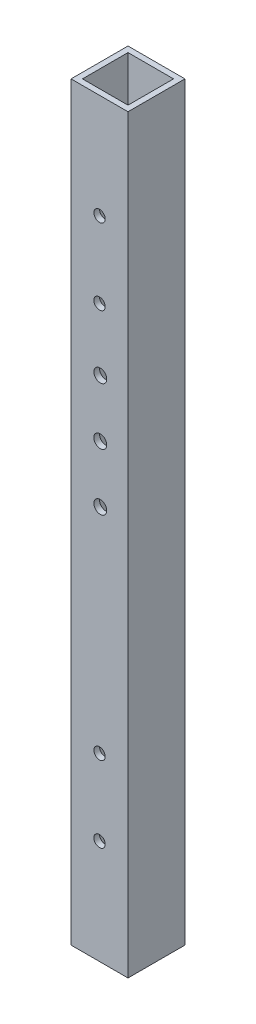
ISO-10303-21;
HEADER;
FILE_DESCRIPTION(('STEP AP214'),'2;1');
FILE_NAME('part.step','',(''),(''),'','','');
FILE_SCHEMA(('AUTOMOTIVE_DESIGN { 1 0 10303 214 1 1 1 1 }'));
ENDSEC;
DATA;
#1=APPLICATION_CONTEXT('core data for automotive mechanical design processes');
#2=APPLICATION_PROTOCOL_DEFINITION('international standard','automotive_design',2000,#1);
#3=PRODUCT_CONTEXT('',#1,'mechanical');
#4=PRODUCT('Part','Part','',(#3));
#5=PRODUCT_RELATED_PRODUCT_CATEGORY('part','',(#4));
#6=PRODUCT_DEFINITION_FORMATION('','',#4);
#7=PRODUCT_DEFINITION_CONTEXT('part definition',#1,'design');
#8=PRODUCT_DEFINITION('design','',#6,#7);
#9=PRODUCT_DEFINITION_SHAPE('','',#8);
#10=(LENGTH_UNIT() NAMED_UNIT(*) SI_UNIT(.MILLI.,.METRE.));
#11=(NAMED_UNIT(*) PLANE_ANGLE_UNIT() SI_UNIT($,.RADIAN.));
#12=(NAMED_UNIT(*) SI_UNIT($,.STERADIAN.) SOLID_ANGLE_UNIT());
#13=UNCERTAINTY_MEASURE_WITH_UNIT(LENGTH_MEASURE(1.E-05),#10,'distance_accuracy_value','');
#14=(GEOMETRIC_REPRESENTATION_CONTEXT(3) GLOBAL_UNCERTAINTY_ASSIGNED_CONTEXT((#13)) GLOBAL_UNIT_ASSIGNED_CONTEXT((#10,
#11,#12)) REPRESENTATION_CONTEXT('',''));
#15=CARTESIAN_POINT('',(0.,0.,0.));
#16=DIRECTION('',(0.,0.,1.));
#17=DIRECTION('',(1.,0.,0.));
#18=AXIS2_PLACEMENT_3D('',#15,#16,#17);
#19=CARTESIAN_POINT('',(0.,197.65,0.));
#20=DIRECTION('',(0.,-1.,0.));
#21=DIRECTION('',(0.,0.,-1.));
#22=AXIS2_PLACEMENT_3D('',#19,#20,#21);
#23=PLANE('',#22);
#24=DIRECTION('',(0.,0.,1.));
#25=VECTOR('',#24,1.);
#26=CARTESIAN_POINT('',(0.,197.65,0.));
#27=LINE('',#26,#25);
#28=CARTESIAN_POINT('',(0.,197.65,-15.));
#29=VERTEX_POINT('',#28);
#30=CARTESIAN_POINT('',(0.,197.65,0.));
#31=VERTEX_POINT('',#30);
#32=EDGE_CURVE('E150',#29,#31,#27,.T.);
#33=ORIENTED_EDGE('',*,*,#32,.T.);
#34=DIRECTION('',(1.,0.,0.));
#35=VECTOR('',#34,1.);
#36=CARTESIAN_POINT('',(0.,197.65,0.));
#37=LINE('',#36,#35);
#38=CARTESIAN_POINT('',(15.,197.65,0.));
#39=VERTEX_POINT('',#38);
#40=EDGE_CURVE('E153',#31,#39,#37,.T.);
#41=ORIENTED_EDGE('',*,*,#40,.T.);
#42=DIRECTION('',(0.,0.,-1.));
#43=VECTOR('',#42,1.);
#44=CARTESIAN_POINT('',(15.,197.65,0.));
#45=LINE('',#44,#43);
#46=CARTESIAN_POINT('',(15.,197.65,-15.));
#47=VERTEX_POINT('',#46);
#48=EDGE_CURVE('E156',#39,#47,#45,.T.);
#49=ORIENTED_EDGE('',*,*,#48,.T.);
#50=DIRECTION('',(-1.,0.,0.));
#51=VECTOR('',#50,1.);
#52=CARTESIAN_POINT('',(0.,197.65,-15.));
#53=LINE('',#52,#51);
#54=EDGE_CURVE('E158',#47,#29,#53,.T.);
#55=ORIENTED_EDGE('',*,*,#54,.T.);
#56=EDGE_LOOP('',(#33,#41,#49,#55));
#57=FACE_BOUND('',#56,.T.);
#58=DIRECTION('',(1.,0.,0.));
#59=VECTOR('',#58,1.);
#60=CARTESIAN_POINT('',(1.5,197.65,-1.5));
#61=LINE('',#60,#59);
#62=CARTESIAN_POINT('',(1.5,197.65,-1.5));
#63=VERTEX_POINT('',#62);
#64=CARTESIAN_POINT('',(13.5,197.65,-1.5));
#65=VERTEX_POINT('',#64);
#66=EDGE_CURVE('E112',#63,#65,#61,.T.);
#67=ORIENTED_EDGE('',*,*,#66,.F.);
#68=DIRECTION('',(0.,0.,1.));
#69=VECTOR('',#68,1.);
#70=CARTESIAN_POINT('',(1.5,197.65,-1.5));
#71=LINE('',#70,#69);
#72=CARTESIAN_POINT('',(1.5,197.65,-13.5));
#73=VERTEX_POINT('',#72);
#74=EDGE_CURVE('E134',#73,#63,#71,.T.);
#75=ORIENTED_EDGE('',*,*,#74,.F.);
#76=DIRECTION('',(-1.,0.,0.));
#77=VECTOR('',#76,1.);
#78=CARTESIAN_POINT('',(1.5,197.65,-13.5));
#79=LINE('',#78,#77);
#80=CARTESIAN_POINT('',(13.5,197.65,-13.5));
#81=VERTEX_POINT('',#80);
#82=EDGE_CURVE('E132',#81,#73,#79,.T.);
#83=ORIENTED_EDGE('',*,*,#82,.F.);
#84=DIRECTION('',(0.,0.,-1.));
#85=VECTOR('',#84,1.);
#86=CARTESIAN_POINT('',(13.5,197.65,-1.5));
#87=LINE('',#86,#85);
#88=EDGE_CURVE('E120',#65,#81,#87,.T.);
#89=ORIENTED_EDGE('',*,*,#88,.F.);
#90=EDGE_LOOP('',(#67,#75,#83,#89));
#91=FACE_BOUND('',#90,.T.);
#92=ADVANCED_FACE('F45',(#57,#91),#23,.F.);
#93=CARTESIAN_POINT('',(0.,0.,0.));
#94=DIRECTION('',(0.,-1.,0.));
#95=DIRECTION('',(0.,0.,-1.));
#96=AXIS2_PLACEMENT_3D('',#93,#94,#95);
#97=PLANE('',#96);
#98=DIRECTION('',(0.,0.,1.));
#99=VECTOR('',#98,1.);
#100=CARTESIAN_POINT('',(0.,0.,0.));
#101=LINE('',#100,#99);
#102=CARTESIAN_POINT('',(0.,0.,-15.));
#103=VERTEX_POINT('',#102);
#104=CARTESIAN_POINT('',(0.,0.,0.));
#105=VERTEX_POINT('',#104);
#106=EDGE_CURVE('E128',#103,#105,#101,.T.);
#107=ORIENTED_EDGE('',*,*,#106,.F.);
#108=DIRECTION('',(-1.,0.,0.));
#109=VECTOR('',#108,1.);
#110=CARTESIAN_POINT('',(0.,0.,-15.));
#111=LINE('',#110,#109);
#112=CARTESIAN_POINT('',(15.,0.,-15.));
#113=VERTEX_POINT('',#112);
#114=EDGE_CURVE('E154',#113,#103,#111,.T.);
#115=ORIENTED_EDGE('',*,*,#114,.F.);
#116=DIRECTION('',(0.,0.,-1.));
#117=VECTOR('',#116,1.);
#118=CARTESIAN_POINT('',(15.,0.,0.));
#119=LINE('',#118,#117);
#120=CARTESIAN_POINT('',(15.,0.,0.));
#121=VERTEX_POINT('',#120);
#122=EDGE_CURVE('E165',#121,#113,#119,.T.);
#123=ORIENTED_EDGE('',*,*,#122,.F.);
#124=DIRECTION('',(1.,0.,0.));
#125=VECTOR('',#124,1.);
#126=CARTESIAN_POINT('',(0.,0.,0.));
#127=LINE('',#126,#125);
#128=EDGE_CURVE('E163',#105,#121,#127,.T.);
#129=ORIENTED_EDGE('',*,*,#128,.F.);
#130=EDGE_LOOP('',(#107,#115,#123,#129));
#131=FACE_BOUND('',#130,.T.);
#132=DIRECTION('',(0.,0.,1.));
#133=VECTOR('',#132,1.);
#134=CARTESIAN_POINT('',(1.5,0.,-1.5));
#135=LINE('',#134,#133);
#136=CARTESIAN_POINT('',(1.5,0.,-13.5));
#137=VERTEX_POINT('',#136);
#138=CARTESIAN_POINT('',(1.5,0.,-1.5));
#139=VERTEX_POINT('',#138);
#140=EDGE_CURVE('E121',#137,#139,#135,.T.);
#141=ORIENTED_EDGE('',*,*,#140,.T.);
#142=DIRECTION('',(1.,0.,0.));
#143=VECTOR('',#142,1.);
#144=CARTESIAN_POINT('',(1.5,0.,-1.5));
#145=LINE('',#144,#143);
#146=CARTESIAN_POINT('',(13.5,0.,-1.5));
#147=VERTEX_POINT('',#146);
#148=EDGE_CURVE('E70',#139,#147,#145,.T.);
#149=ORIENTED_EDGE('',*,*,#148,.T.);
#150=DIRECTION('',(0.,0.,-1.));
#151=VECTOR('',#150,1.);
#152=CARTESIAN_POINT('',(13.5,0.,-1.5));
#153=LINE('',#152,#151);
#154=CARTESIAN_POINT('',(13.5,0.,-13.5));
#155=VERTEX_POINT('',#154);
#156=EDGE_CURVE('E127',#147,#155,#153,.T.);
#157=ORIENTED_EDGE('',*,*,#156,.T.);
#158=DIRECTION('',(-1.,0.,0.));
#159=VECTOR('',#158,1.);
#160=CARTESIAN_POINT('',(1.5,0.,-13.5));
#161=LINE('',#160,#159);
#162=EDGE_CURVE('E142',#155,#137,#161,.T.);
#163=ORIENTED_EDGE('',*,*,#162,.T.);
#164=EDGE_LOOP('',(#141,#149,#157,#163));
#165=FACE_BOUND('',#164,.T.);
#166=ADVANCED_FACE('F235',(#131,#165),#97,.T.);
#167=CARTESIAN_POINT('',(0.,197.65,0.));
#168=DIRECTION('',(1.,0.,0.));
#169=DIRECTION('',(0.,0.,-1.));
#170=AXIS2_PLACEMENT_3D('',#167,#168,#169);
#171=PLANE('',#170);
#172=ORIENTED_EDGE('',*,*,#106,.T.);
#173=DIRECTION('',(0.,-1.,0.));
#174=VECTOR('',#173,1.);
#175=CARTESIAN_POINT('',(0.,197.65,0.));
#176=LINE('',#175,#174);
#177=EDGE_CURVE('E11',#31,#105,#176,.T.);
#178=ORIENTED_EDGE('',*,*,#177,.F.);
#179=ORIENTED_EDGE('',*,*,#32,.F.);
#180=DIRECTION('',(0.,-1.,0.));
#181=VECTOR('',#180,1.);
#182=CARTESIAN_POINT('',(0.,197.65,-15.));
#183=LINE('',#182,#181);
#184=EDGE_CURVE('E160',#29,#103,#183,.T.);
#185=ORIENTED_EDGE('',*,*,#184,.T.);
#186=EDGE_LOOP('',(#172,#178,#179,#185));
#187=FACE_BOUND('',#186,.T.);
#188=ADVANCED_FACE('F47',(#187),#171,.F.);
#189=CARTESIAN_POINT('',(0.,197.65,0.));
#190=DIRECTION('',(0.,0.,-1.));
#191=DIRECTION('',(-1.,0.,0.));
#192=AXIS2_PLACEMENT_3D('',#189,#190,#191);
#193=PLANE('',#192);
#194=CARTESIAN_POINT('',(7.50000000000014,170.149999999999,0.));
#195=DIRECTION('',(0.,0.,1.));
#196=DIRECTION('',(1.,0.,0.));
#197=AXIS2_PLACEMENT_3D('',#194,#195,#196);
#198=CIRCLE('',#197,1.5);
#199=CARTESIAN_POINT('',(9.00000000000014,170.149999999999,0.));
#200=VERTEX_POINT('',#199);
#201=EDGE_CURVE('E275',#200,#200,#198,.T.);
#202=ORIENTED_EDGE('',*,*,#201,.F.);
#203=EDGE_LOOP('',(#202));
#204=FACE_BOUND('',#203,.T.);
#205=CARTESIAN_POINT('',(7.50000000000036,150.149999999999,0.));
#206=DIRECTION('',(0.,0.,1.));
#207=DIRECTION('',(1.,0.,0.));
#208=AXIS2_PLACEMENT_3D('',#205,#206,#207);
#209=CIRCLE('',#208,1.5);
#210=CARTESIAN_POINT('',(9.00000000000036,150.149999999999,0.));
#211=VERTEX_POINT('',#210);
#212=EDGE_CURVE('E279',#211,#211,#209,.T.);
#213=ORIENTED_EDGE('',*,*,#212,.F.);
#214=EDGE_LOOP('',(#213));
#215=FACE_BOUND('',#214,.T.);
#216=CARTESIAN_POINT('',(7.7,133.825,0.));
#217=DIRECTION('',(0.,0.,1.));
#218=DIRECTION('',(1.,0.,0.));
#219=AXIS2_PLACEMENT_3D('',#216,#217,#218);
#220=CIRCLE('',#219,1.69999999999998);
#221=CARTESIAN_POINT('',(9.39999999999999,133.825,0.));
#222=VERTEX_POINT('',#221);
#223=EDGE_CURVE('E283',#222,#222,#220,.T.);
#224=ORIENTED_EDGE('',*,*,#223,.F.);
#225=EDGE_LOOP('',(#224));
#226=FACE_BOUND('',#225,.T.);
#227=CARTESIAN_POINT('',(7.70000000000001,118.825,0.));
#228=DIRECTION('',(0.,0.,1.));
#229=DIRECTION('',(1.,0.,0.));
#230=AXIS2_PLACEMENT_3D('',#227,#228,#229);
#231=CIRCLE('',#230,1.69999999999999);
#232=CARTESIAN_POINT('',(9.4,118.825,0.));
#233=VERTEX_POINT('',#232);
#234=EDGE_CURVE('E287',#233,#233,#231,.T.);
#235=ORIENTED_EDGE('',*,*,#234,.F.);
#236=EDGE_LOOP('',(#235));
#237=FACE_BOUND('',#236,.T.);
#238=CARTESIAN_POINT('',(7.7,103.825,0.));
#239=DIRECTION('',(0.,0.,1.));
#240=DIRECTION('',(1.,0.,0.));
#241=AXIS2_PLACEMENT_3D('',#238,#239,#240);
#242=CIRCLE('',#241,1.69999999999999);
#243=CARTESIAN_POINT('',(9.4,103.825,0.));
#244=VERTEX_POINT('',#243);
#245=EDGE_CURVE('E291',#244,#244,#242,.T.);
#246=ORIENTED_EDGE('',*,*,#245,.F.);
#247=EDGE_LOOP('',(#246));
#248=FACE_BOUND('',#247,.T.);
#249=CARTESIAN_POINT('',(7.50000000000192,27.4999999999989,0.));
#250=DIRECTION('',(0.,0.,1.));
#251=DIRECTION('',(1.,0.,0.));
#252=AXIS2_PLACEMENT_3D('',#249,#250,#251);
#253=CIRCLE('',#252,1.5);
#254=CARTESIAN_POINT('',(9.00000000000192,27.4999999999989,0.));
#255=VERTEX_POINT('',#254);
#256=EDGE_CURVE('E295',#255,#255,#253,.T.);
#257=ORIENTED_EDGE('',*,*,#256,.F.);
#258=EDGE_LOOP('',(#257));
#259=FACE_BOUND('',#258,.T.);
#260=CARTESIAN_POINT('',(7.50000000000193,47.4999999999989,0.));
#261=DIRECTION('',(0.,0.,1.));
#262=DIRECTION('',(1.,0.,0.));
#263=AXIS2_PLACEMENT_3D('',#260,#261,#262);
#264=CIRCLE('',#263,1.5);
#265=CARTESIAN_POINT('',(9.00000000000193,47.4999999999989,0.));
#266=VERTEX_POINT('',#265);
#267=EDGE_CURVE('E299',#266,#266,#264,.T.);
#268=ORIENTED_EDGE('',*,*,#267,.F.);
#269=EDGE_LOOP('',(#268));
#270=FACE_BOUND('',#269,.T.);
#271=ORIENTED_EDGE('',*,*,#128,.T.);
#272=DIRECTION('',(0.,-1.,0.));
#273=VECTOR('',#272,1.);
#274=CARTESIAN_POINT('',(15.,197.65,0.));
#275=LINE('',#274,#273);
#276=EDGE_CURVE('E54',#39,#121,#275,.T.);
#277=ORIENTED_EDGE('',*,*,#276,.F.);
#278=ORIENTED_EDGE('',*,*,#40,.F.);
#279=ORIENTED_EDGE('',*,*,#177,.T.);
#280=EDGE_LOOP('',(#271,#277,#278,#279));
#281=FACE_BOUND('',#280,.T.);
#282=ADVANCED_FACE('F265',(#204,#215,#226,#237,#248,#259,#270,#281),#193,.F.);
#283=CARTESIAN_POINT('',(15.,197.65,0.));
#284=DIRECTION('',(-1.,0.,0.));
#285=DIRECTION('',(0.,0.,1.));
#286=AXIS2_PLACEMENT_3D('',#283,#284,#285);
#287=PLANE('',#286);
#288=ORIENTED_EDGE('',*,*,#122,.T.);
#289=DIRECTION('',(0.,-1.,0.));
#290=VECTOR('',#289,1.);
#291=CARTESIAN_POINT('',(15.,197.65,-15.));
#292=LINE('',#291,#290);
#293=EDGE_CURVE('E170',#47,#113,#292,.T.);
#294=ORIENTED_EDGE('',*,*,#293,.F.);
#295=ORIENTED_EDGE('',*,*,#48,.F.);
#296=ORIENTED_EDGE('',*,*,#276,.T.);
#297=EDGE_LOOP('',(#288,#294,#295,#296));
#298=FACE_BOUND('',#297,.T.);
#299=ADVANCED_FACE('F262',(#298),#287,.F.);
#300=CARTESIAN_POINT('',(0.,197.65,-15.));
#301=DIRECTION('',(0.,0.,1.));
#302=DIRECTION('',(1.,0.,0.));
#303=AXIS2_PLACEMENT_3D('',#300,#301,#302);
#304=PLANE('',#303);
#305=CARTESIAN_POINT('',(7.50000000000014,170.149999999999,-15.));
#306=DIRECTION('',(0.,0.,1.));
#307=DIRECTION('',(1.,0.,0.));
#308=AXIS2_PLACEMENT_3D('',#305,#306,#307);
#309=CIRCLE('',#308,1.5);
#310=CARTESIAN_POINT('',(9.00000000000014,170.149999999999,-15.));
#311=VERTEX_POINT('',#310);
#312=EDGE_CURVE('E389',#311,#311,#309,.T.);
#313=ORIENTED_EDGE('',*,*,#312,.T.);
#314=EDGE_LOOP('',(#313));
#315=FACE_BOUND('',#314,.T.);
#316=CARTESIAN_POINT('',(7.50000000000036,150.149999999999,-15.));
#317=DIRECTION('',(0.,0.,1.));
#318=DIRECTION('',(1.,0.,0.));
#319=AXIS2_PLACEMENT_3D('',#316,#317,#318);
#320=CIRCLE('',#319,1.5);
#321=CARTESIAN_POINT('',(9.00000000000036,150.149999999999,-15.));
#322=VERTEX_POINT('',#321);
#323=EDGE_CURVE('E386',#322,#322,#320,.T.);
#324=ORIENTED_EDGE('',*,*,#323,.T.);
#325=EDGE_LOOP('',(#324));
#326=FACE_BOUND('',#325,.T.);
#327=CARTESIAN_POINT('',(7.7,133.825,-15.));
#328=DIRECTION('',(0.,0.,1.));
#329=DIRECTION('',(1.,0.,0.));
#330=AXIS2_PLACEMENT_3D('',#327,#328,#329);
#331=CIRCLE('',#330,1.69999999999998);
#332=CARTESIAN_POINT('',(9.39999999999999,133.825,-15.));
#333=VERTEX_POINT('',#332);
#334=EDGE_CURVE('E382',#333,#333,#331,.T.);
#335=ORIENTED_EDGE('',*,*,#334,.T.);
#336=EDGE_LOOP('',(#335));
#337=FACE_BOUND('',#336,.T.);
#338=CARTESIAN_POINT('',(7.70000000000001,118.825,-15.));
#339=DIRECTION('',(0.,0.,1.));
#340=DIRECTION('',(1.,0.,0.));
#341=AXIS2_PLACEMENT_3D('',#338,#339,#340);
#342=CIRCLE('',#341,1.69999999999999);
#343=CARTESIAN_POINT('',(9.4,118.825,-15.));
#344=VERTEX_POINT('',#343);
#345=EDGE_CURVE('E378',#344,#344,#342,.T.);
#346=ORIENTED_EDGE('',*,*,#345,.T.);
#347=EDGE_LOOP('',(#346));
#348=FACE_BOUND('',#347,.T.);
#349=CARTESIAN_POINT('',(7.7,103.825,-15.));
#350=DIRECTION('',(0.,0.,1.));
#351=DIRECTION('',(1.,0.,0.));
#352=AXIS2_PLACEMENT_3D('',#349,#350,#351);
#353=CIRCLE('',#352,1.69999999999999);
#354=CARTESIAN_POINT('',(9.4,103.825,-15.));
#355=VERTEX_POINT('',#354);
#356=EDGE_CURVE('E372',#355,#355,#353,.T.);
#357=ORIENTED_EDGE('',*,*,#356,.T.);
#358=EDGE_LOOP('',(#357));
#359=FACE_BOUND('',#358,.T.);
#360=CARTESIAN_POINT('',(7.50000000000192,27.4999999999989,-15.));
#361=DIRECTION('',(0.,0.,1.));
#362=DIRECTION('',(1.,0.,0.));
#363=AXIS2_PLACEMENT_3D('',#360,#361,#362);
#364=CIRCLE('',#363,1.5);
#365=CARTESIAN_POINT('',(9.00000000000192,27.4999999999989,-15.));
#366=VERTEX_POINT('',#365);
#367=EDGE_CURVE('E315',#366,#366,#364,.T.);
#368=ORIENTED_EDGE('',*,*,#367,.T.);
#369=EDGE_LOOP('',(#368));
#370=FACE_BOUND('',#369,.T.);
#371=CARTESIAN_POINT('',(7.50000000000193,47.4999999999989,-15.));
#372=DIRECTION('',(0.,0.,1.));
#373=DIRECTION('',(1.,0.,0.));
#374=AXIS2_PLACEMENT_3D('',#371,#372,#373);
#375=CIRCLE('',#374,1.5);
#376=CARTESIAN_POINT('',(9.00000000000193,47.4999999999989,-15.));
#377=VERTEX_POINT('',#376);
#378=EDGE_CURVE('E179',#377,#377,#375,.T.);
#379=ORIENTED_EDGE('',*,*,#378,.T.);
#380=EDGE_LOOP('',(#379));
#381=FACE_BOUND('',#380,.T.);
#382=ORIENTED_EDGE('',*,*,#114,.T.);
#383=ORIENTED_EDGE('',*,*,#184,.F.);
#384=ORIENTED_EDGE('',*,*,#54,.F.);
#385=ORIENTED_EDGE('',*,*,#293,.T.);
#386=EDGE_LOOP('',(#382,#383,#384,#385));
#387=FACE_BOUND('',#386,.T.);
#388=ADVANCED_FACE('F259',(#315,#326,#337,#348,#359,#370,#381,#387),#304,.F.);
#389=CARTESIAN_POINT('',(1.5,197.65,-1.5));
#390=DIRECTION('',(0.,0.,-1.));
#391=DIRECTION('',(-1.,0.,0.));
#392=AXIS2_PLACEMENT_3D('',#389,#390,#391);
#393=PLANE('',#392);
#394=CARTESIAN_POINT('',(7.50000000000014,170.149999999999,-1.5));
#395=DIRECTION('',(0.,0.,-1.));
#396=DIRECTION('',(-1.,0.,0.));
#397=AXIS2_PLACEMENT_3D('',#394,#395,#396);
#398=CIRCLE('',#397,1.5);
#399=CARTESIAN_POINT('',(6.00000000000014,170.149999999999,-1.5));
#400=VERTEX_POINT('',#399);
#401=EDGE_CURVE('E140',#400,#400,#398,.T.);
#402=ORIENTED_EDGE('',*,*,#401,.F.);
#403=EDGE_LOOP('',(#402));
#404=FACE_BOUND('',#403,.T.);
#405=CARTESIAN_POINT('',(7.50000000000036,150.149999999999,-1.5));
#406=DIRECTION('',(0.,0.,-1.));
#407=DIRECTION('',(-1.,0.,0.));
#408=AXIS2_PLACEMENT_3D('',#405,#406,#407);
#409=CIRCLE('',#408,1.5);
#410=CARTESIAN_POINT('',(6.00000000000036,150.149999999999,-1.5));
#411=VERTEX_POINT('',#410);
#412=EDGE_CURVE('E197',#411,#411,#409,.T.);
#413=ORIENTED_EDGE('',*,*,#412,.F.);
#414=EDGE_LOOP('',(#413));
#415=FACE_BOUND('',#414,.T.);
#416=CARTESIAN_POINT('',(7.7,133.825,-1.5));
#417=DIRECTION('',(0.,0.,-1.));
#418=DIRECTION('',(-1.,0.,0.));
#419=AXIS2_PLACEMENT_3D('',#416,#417,#418);
#420=CIRCLE('',#419,1.69999999999998);
#421=CARTESIAN_POINT('',(6.00000000000002,133.825,-1.5));
#422=VERTEX_POINT('',#421);
#423=EDGE_CURVE('E194',#422,#422,#420,.T.);
#424=ORIENTED_EDGE('',*,*,#423,.F.);
#425=EDGE_LOOP('',(#424));
#426=FACE_BOUND('',#425,.T.);
#427=CARTESIAN_POINT('',(7.70000000000001,118.825,-1.5));
#428=DIRECTION('',(0.,0.,-1.));
#429=DIRECTION('',(-1.,0.,0.));
#430=AXIS2_PLACEMENT_3D('',#427,#428,#429);
#431=CIRCLE('',#430,1.69999999999999);
#432=CARTESIAN_POINT('',(6.00000000000001,118.825,-1.5));
#433=VERTEX_POINT('',#432);
#434=EDGE_CURVE('E191',#433,#433,#431,.T.);
#435=ORIENTED_EDGE('',*,*,#434,.F.);
#436=EDGE_LOOP('',(#435));
#437=FACE_BOUND('',#436,.T.);
#438=CARTESIAN_POINT('',(7.7,103.825,-1.5));
#439=DIRECTION('',(0.,0.,-1.));
#440=DIRECTION('',(-1.,0.,0.));
#441=AXIS2_PLACEMENT_3D('',#438,#439,#440);
#442=CIRCLE('',#441,1.69999999999999);
#443=CARTESIAN_POINT('',(6.00000000000001,103.825,-1.5));
#444=VERTEX_POINT('',#443);
#445=EDGE_CURVE('E187',#444,#444,#442,.T.);
#446=ORIENTED_EDGE('',*,*,#445,.F.);
#447=EDGE_LOOP('',(#446));
#448=FACE_BOUND('',#447,.T.);
#449=CARTESIAN_POINT('',(7.50000000000192,27.4999999999989,-1.5));
#450=DIRECTION('',(0.,0.,-1.));
#451=DIRECTION('',(-1.,0.,0.));
#452=AXIS2_PLACEMENT_3D('',#449,#450,#451);
#453=CIRCLE('',#452,1.5);
#454=CARTESIAN_POINT('',(6.00000000000192,27.4999999999989,-1.5));
#455=VERTEX_POINT('',#454);
#456=EDGE_CURVE('E183',#455,#455,#453,.T.);
#457=ORIENTED_EDGE('',*,*,#456,.F.);
#458=EDGE_LOOP('',(#457));
#459=FACE_BOUND('',#458,.T.);
#460=CARTESIAN_POINT('',(7.50000000000193,47.4999999999989,-1.5));
#461=DIRECTION('',(0.,0.,-1.));
#462=DIRECTION('',(-1.,0.,0.));
#463=AXIS2_PLACEMENT_3D('',#460,#461,#462);
#464=CIRCLE('',#463,1.5);
#465=CARTESIAN_POINT('',(6.00000000000192,47.4999999999989,-1.5));
#466=VERTEX_POINT('',#465);
#467=EDGE_CURVE('E178',#466,#466,#464,.T.);
#468=ORIENTED_EDGE('',*,*,#467,.F.);
#469=EDGE_LOOP('',(#468));
#470=FACE_BOUND('',#469,.T.);
#471=ORIENTED_EDGE('',*,*,#148,.F.);
#472=DIRECTION('',(0.,-1.,0.));
#473=VECTOR('',#472,1.);
#474=CARTESIAN_POINT('',(1.5,197.65,-1.5));
#475=LINE('',#474,#473);
#476=EDGE_CURVE('E116',#63,#139,#475,.T.);
#477=ORIENTED_EDGE('',*,*,#476,.F.);
#478=ORIENTED_EDGE('',*,*,#66,.T.);
#479=DIRECTION('',(0.,-1.,0.));
#480=VECTOR('',#479,1.);
#481=CARTESIAN_POINT('',(13.5,197.65,-1.5));
#482=LINE('',#481,#480);
#483=EDGE_CURVE('E115',#65,#147,#482,.T.);
#484=ORIENTED_EDGE('',*,*,#483,.T.);
#485=EDGE_LOOP('',(#471,#477,#478,#484));
#486=FACE_BOUND('',#485,.T.);
#487=ADVANCED_FACE('F114',(#404,#415,#426,#437,#448,#459,#470,#486),#393,.T.);
#488=CARTESIAN_POINT('',(13.5,197.65,-1.5));
#489=DIRECTION('',(-1.,0.,0.));
#490=DIRECTION('',(0.,0.,1.));
#491=AXIS2_PLACEMENT_3D('',#488,#489,#490);
#492=PLANE('',#491);
#493=ORIENTED_EDGE('',*,*,#156,.F.);
#494=ORIENTED_EDGE('',*,*,#483,.F.);
#495=ORIENTED_EDGE('',*,*,#88,.T.);
#496=DIRECTION('',(0.,-1.,0.));
#497=VECTOR('',#496,1.);
#498=CARTESIAN_POINT('',(13.5,197.65,-13.5));
#499=LINE('',#498,#497);
#500=EDGE_CURVE('E129',#81,#155,#499,.T.);
#501=ORIENTED_EDGE('',*,*,#500,.T.);
#502=EDGE_LOOP('',(#493,#494,#495,#501));
#503=FACE_BOUND('',#502,.T.);
#504=ADVANCED_FACE('F124',(#503),#492,.T.);
#505=CARTESIAN_POINT('',(1.5,197.65,-13.5));
#506=DIRECTION('',(0.,0.,1.));
#507=DIRECTION('',(1.,0.,0.));
#508=AXIS2_PLACEMENT_3D('',#505,#506,#507);
#509=PLANE('',#508);
#510=CARTESIAN_POINT('',(7.50000000000014,170.149999999999,-13.5));
#511=DIRECTION('',(0.,0.,1.));
#512=DIRECTION('',(1.,0.,0.));
#513=AXIS2_PLACEMENT_3D('',#510,#511,#512);
#514=CIRCLE('',#513,1.5);
#515=CARTESIAN_POINT('',(9.00000000000014,170.149999999999,-13.5));
#516=VERTEX_POINT('',#515);
#517=EDGE_CURVE('E49',#516,#516,#514,.T.);
#518=ORIENTED_EDGE('',*,*,#517,.F.);
#519=EDGE_LOOP('',(#518));
#520=FACE_BOUND('',#519,.T.);
#521=CARTESIAN_POINT('',(7.50000000000036,150.149999999999,-13.5));
#522=DIRECTION('',(0.,0.,1.));
#523=DIRECTION('',(1.,0.,0.));
#524=AXIS2_PLACEMENT_3D('',#521,#522,#523);
#525=CIRCLE('',#524,1.5);
#526=CARTESIAN_POINT('',(9.00000000000036,150.149999999999,-13.5));
#527=VERTEX_POINT('',#526);
#528=EDGE_CURVE('E195',#527,#527,#525,.T.);
#529=ORIENTED_EDGE('',*,*,#528,.F.);
#530=EDGE_LOOP('',(#529));
#531=FACE_BOUND('',#530,.T.);
#532=CARTESIAN_POINT('',(7.7,133.825,-13.5));
#533=DIRECTION('',(0.,0.,1.));
#534=DIRECTION('',(1.,0.,0.));
#535=AXIS2_PLACEMENT_3D('',#532,#533,#534);
#536=CIRCLE('',#535,1.69999999999998);
#537=CARTESIAN_POINT('',(9.39999999999999,133.825,-13.5));
#538=VERTEX_POINT('',#537);
#539=EDGE_CURVE('E192',#538,#538,#536,.T.);
#540=ORIENTED_EDGE('',*,*,#539,.F.);
#541=EDGE_LOOP('',(#540));
#542=FACE_BOUND('',#541,.T.);
#543=CARTESIAN_POINT('',(7.70000000000001,118.825,-13.5));
#544=DIRECTION('',(0.,0.,1.));
#545=DIRECTION('',(1.,0.,0.));
#546=AXIS2_PLACEMENT_3D('',#543,#544,#545);
#547=CIRCLE('',#546,1.69999999999999);
#548=CARTESIAN_POINT('',(9.4,118.825,-13.5));
#549=VERTEX_POINT('',#548);
#550=EDGE_CURVE('E188',#549,#549,#547,.T.);
#551=ORIENTED_EDGE('',*,*,#550,.F.);
#552=EDGE_LOOP('',(#551));
#553=FACE_BOUND('',#552,.T.);
#554=CARTESIAN_POINT('',(7.7,103.825,-13.5));
#555=DIRECTION('',(0.,0.,1.));
#556=DIRECTION('',(1.,0.,0.));
#557=AXIS2_PLACEMENT_3D('',#554,#555,#556);
#558=CIRCLE('',#557,1.69999999999999);
#559=CARTESIAN_POINT('',(9.4,103.825,-13.5));
#560=VERTEX_POINT('',#559);
#561=EDGE_CURVE('E184',#560,#560,#558,.T.);
#562=ORIENTED_EDGE('',*,*,#561,.F.);
#563=EDGE_LOOP('',(#562));
#564=FACE_BOUND('',#563,.T.);
#565=CARTESIAN_POINT('',(7.50000000000192,27.4999999999989,-13.5));
#566=DIRECTION('',(0.,0.,1.));
#567=DIRECTION('',(1.,0.,0.));
#568=AXIS2_PLACEMENT_3D('',#565,#566,#567);
#569=CIRCLE('',#568,1.5);
#570=CARTESIAN_POINT('',(9.00000000000192,27.4999999999989,-13.5));
#571=VERTEX_POINT('',#570);
#572=EDGE_CURVE('E180',#571,#571,#569,.T.);
#573=ORIENTED_EDGE('',*,*,#572,.F.);
#574=EDGE_LOOP('',(#573));
#575=FACE_BOUND('',#574,.T.);
#576=CARTESIAN_POINT('',(7.50000000000193,47.4999999999989,-13.5));
#577=DIRECTION('',(0.,0.,1.));
#578=DIRECTION('',(1.,0.,0.));
#579=AXIS2_PLACEMENT_3D('',#576,#577,#578);
#580=CIRCLE('',#579,1.5);
#581=CARTESIAN_POINT('',(9.00000000000193,47.4999999999989,-13.5));
#582=VERTEX_POINT('',#581);
#583=EDGE_CURVE('E175',#582,#582,#580,.T.);
#584=ORIENTED_EDGE('',*,*,#583,.F.);
#585=EDGE_LOOP('',(#584));
#586=FACE_BOUND('',#585,.T.);
#587=ORIENTED_EDGE('',*,*,#162,.F.);
#588=ORIENTED_EDGE('',*,*,#500,.F.);
#589=ORIENTED_EDGE('',*,*,#82,.T.);
#590=DIRECTION('',(0.,-1.,0.));
#591=VECTOR('',#590,1.);
#592=CARTESIAN_POINT('',(1.5,197.65,-13.5));
#593=LINE('',#592,#591);
#594=EDGE_CURVE('E62',#73,#137,#593,.T.);
#595=ORIENTED_EDGE('',*,*,#594,.T.);
#596=EDGE_LOOP('',(#587,#588,#589,#595));
#597=FACE_BOUND('',#596,.T.);
#598=ADVANCED_FACE('F217',(#520,#531,#542,#553,#564,#575,#586,#597),#509,.T.);
#599=CARTESIAN_POINT('',(1.5,197.65,-1.5));
#600=DIRECTION('',(1.,0.,0.));
#601=DIRECTION('',(0.,0.,-1.));
#602=AXIS2_PLACEMENT_3D('',#599,#600,#601);
#603=PLANE('',#602);
#604=ORIENTED_EDGE('',*,*,#140,.F.);
#605=ORIENTED_EDGE('',*,*,#594,.F.);
#606=ORIENTED_EDGE('',*,*,#74,.T.);
#607=ORIENTED_EDGE('',*,*,#476,.T.);
#608=EDGE_LOOP('',(#604,#605,#606,#607));
#609=FACE_BOUND('',#608,.T.);
#610=ADVANCED_FACE('F220',(#609),#603,.T.);
#611=CARTESIAN_POINT('',(7.50000000000193,47.4999999999989,-15.));
#612=DIRECTION('',(0.,0.,1.));
#613=DIRECTION('',(1.,0.,0.));
#614=AXIS2_PLACEMENT_3D('',#611,#612,#613);
#615=CYLINDRICAL_SURFACE('',#614,1.5);
#616=ORIENTED_EDGE('',*,*,#583,.T.);
#617=EDGE_LOOP('',(#616));
#618=FACE_BOUND('',#617,.T.);
#619=ORIENTED_EDGE('',*,*,#378,.F.);
#620=EDGE_LOOP('',(#619));
#621=FACE_BOUND('',#620,.T.);
#622=ADVANCED_FACE('F237',(#618,#621),#615,.F.);
#623=CARTESIAN_POINT('',(7.50000000000192,27.4999999999989,-15.));
#624=DIRECTION('',(0.,0.,1.));
#625=DIRECTION('',(1.,0.,0.));
#626=AXIS2_PLACEMENT_3D('',#623,#624,#625);
#627=CYLINDRICAL_SURFACE('',#626,1.5);
#628=ORIENTED_EDGE('',*,*,#572,.T.);
#629=EDGE_LOOP('',(#628));
#630=FACE_BOUND('',#629,.T.);
#631=ORIENTED_EDGE('',*,*,#367,.F.);
#632=EDGE_LOOP('',(#631));
#633=FACE_BOUND('',#632,.T.);
#634=ADVANCED_FACE('F244',(#630,#633),#627,.F.);
#635=CARTESIAN_POINT('',(7.7,103.825,-15.));
#636=DIRECTION('',(0.,0.,1.));
#637=DIRECTION('',(1.,0.,0.));
#638=AXIS2_PLACEMENT_3D('',#635,#636,#637);
#639=CYLINDRICAL_SURFACE('',#638,1.69999999999999);
#640=ORIENTED_EDGE('',*,*,#561,.T.);
#641=EDGE_LOOP('',(#640));
#642=FACE_BOUND('',#641,.T.);
#643=ORIENTED_EDGE('',*,*,#356,.F.);
#644=EDGE_LOOP('',(#643));
#645=FACE_BOUND('',#644,.T.);
#646=ADVANCED_FACE('F358',(#642,#645),#639,.F.);
#647=CARTESIAN_POINT('',(7.70000000000001,118.825,-15.));
#648=DIRECTION('',(0.,0.,1.));
#649=DIRECTION('',(1.,0.,0.));
#650=AXIS2_PLACEMENT_3D('',#647,#648,#649);
#651=CYLINDRICAL_SURFACE('',#650,1.69999999999999);
#652=ORIENTED_EDGE('',*,*,#550,.T.);
#653=EDGE_LOOP('',(#652));
#654=FACE_BOUND('',#653,.T.);
#655=ORIENTED_EDGE('',*,*,#345,.F.);
#656=EDGE_LOOP('',(#655));
#657=FACE_BOUND('',#656,.T.);
#658=ADVANCED_FACE('F353',(#654,#657),#651,.F.);
#659=CARTESIAN_POINT('',(7.7,133.825,-15.));
#660=DIRECTION('',(0.,0.,1.));
#661=DIRECTION('',(1.,0.,0.));
#662=AXIS2_PLACEMENT_3D('',#659,#660,#661);
#663=CYLINDRICAL_SURFACE('',#662,1.69999999999998);
#664=ORIENTED_EDGE('',*,*,#539,.T.);
#665=EDGE_LOOP('',(#664));
#666=FACE_BOUND('',#665,.T.);
#667=ORIENTED_EDGE('',*,*,#334,.F.);
#668=EDGE_LOOP('',(#667));
#669=FACE_BOUND('',#668,.T.);
#670=ADVANCED_FACE('F349',(#666,#669),#663,.F.);
#671=CARTESIAN_POINT('',(7.50000000000036,150.149999999999,-15.));
#672=DIRECTION('',(0.,0.,1.));
#673=DIRECTION('',(1.,0.,0.));
#674=AXIS2_PLACEMENT_3D('',#671,#672,#673);
#675=CYLINDRICAL_SURFACE('',#674,1.5);
#676=ORIENTED_EDGE('',*,*,#528,.T.);
#677=EDGE_LOOP('',(#676));
#678=FACE_BOUND('',#677,.T.);
#679=ORIENTED_EDGE('',*,*,#323,.F.);
#680=EDGE_LOOP('',(#679));
#681=FACE_BOUND('',#680,.T.);
#682=ADVANCED_FACE('F343',(#678,#681),#675,.F.);
#683=CARTESIAN_POINT('',(7.50000000000014,170.149999999999,-15.));
#684=DIRECTION('',(0.,0.,1.));
#685=DIRECTION('',(1.,0.,0.));
#686=AXIS2_PLACEMENT_3D('',#683,#684,#685);
#687=CYLINDRICAL_SURFACE('',#686,1.5);
#688=ORIENTED_EDGE('',*,*,#517,.T.);
#689=EDGE_LOOP('',(#688));
#690=FACE_BOUND('',#689,.T.);
#691=ORIENTED_EDGE('',*,*,#312,.F.);
#692=EDGE_LOOP('',(#691));
#693=FACE_BOUND('',#692,.T.);
#694=ADVANCED_FACE('F214',(#690,#693),#687,.F.);
#695=ORIENTED_EDGE('',*,*,#467,.T.);
#696=EDGE_LOOP('',(#695));
#697=FACE_BOUND('',#696,.T.);
#698=ORIENTED_EDGE('',*,*,#267,.T.);
#699=EDGE_LOOP('',(#698));
#700=FACE_BOUND('',#699,.T.);
#701=ADVANCED_FACE('F247',(#697,#700),#615,.F.);
#702=ORIENTED_EDGE('',*,*,#456,.T.);
#703=EDGE_LOOP('',(#702));
#704=FACE_BOUND('',#703,.T.);
#705=ORIENTED_EDGE('',*,*,#256,.T.);
#706=EDGE_LOOP('',(#705));
#707=FACE_BOUND('',#706,.T.);
#708=ADVANCED_FACE('F336',(#704,#707),#627,.F.);
#709=ORIENTED_EDGE('',*,*,#445,.T.);
#710=EDGE_LOOP('',(#709));
#711=FACE_BOUND('',#710,.T.);
#712=ORIENTED_EDGE('',*,*,#245,.T.);
#713=EDGE_LOOP('',(#712));
#714=FACE_BOUND('',#713,.T.);
#715=ADVANCED_FACE('F325',(#711,#714),#639,.F.);
#716=ORIENTED_EDGE('',*,*,#434,.T.);
#717=EDGE_LOOP('',(#716));
#718=FACE_BOUND('',#717,.T.);
#719=ORIENTED_EDGE('',*,*,#234,.T.);
#720=EDGE_LOOP('',(#719));
#721=FACE_BOUND('',#720,.T.);
#722=ADVANCED_FACE('F360',(#718,#721),#651,.F.);
#723=ORIENTED_EDGE('',*,*,#423,.T.);
#724=EDGE_LOOP('',(#723));
#725=FACE_BOUND('',#724,.T.);
#726=ORIENTED_EDGE('',*,*,#223,.T.);
#727=EDGE_LOOP('',(#726));
#728=FACE_BOUND('',#727,.T.);
#729=ADVANCED_FACE('F355',(#725,#728),#663,.F.);
#730=ORIENTED_EDGE('',*,*,#412,.T.);
#731=EDGE_LOOP('',(#730));
#732=FACE_BOUND('',#731,.T.);
#733=ORIENTED_EDGE('',*,*,#212,.T.);
#734=EDGE_LOOP('',(#733));
#735=FACE_BOUND('',#734,.T.);
#736=ADVANCED_FACE('F350',(#732,#735),#675,.F.);
#737=ORIENTED_EDGE('',*,*,#401,.T.);
#738=EDGE_LOOP('',(#737));
#739=FACE_BOUND('',#738,.T.);
#740=ORIENTED_EDGE('',*,*,#201,.T.);
#741=EDGE_LOOP('',(#740));
#742=FACE_BOUND('',#741,.T.);
#743=ADVANCED_FACE('F345',(#739,#742),#687,.F.);
#744=CLOSED_SHELL('',(#92,#166,#188,#282,#299,#388,#487,#504,#598,#610,#622,#634,#646,#658,#670,
#682,#694,#701,#708,#715,#722,#729,#736,#743));
#745=MANIFOLD_SOLID_BREP('B2',#744);
#746=ADVANCED_BREP_SHAPE_REPRESENTATION('',(#18,#745),#14);
#747=SHAPE_DEFINITION_REPRESENTATION(#9,#746);
ENDSEC;
END-ISO-10303-21;
